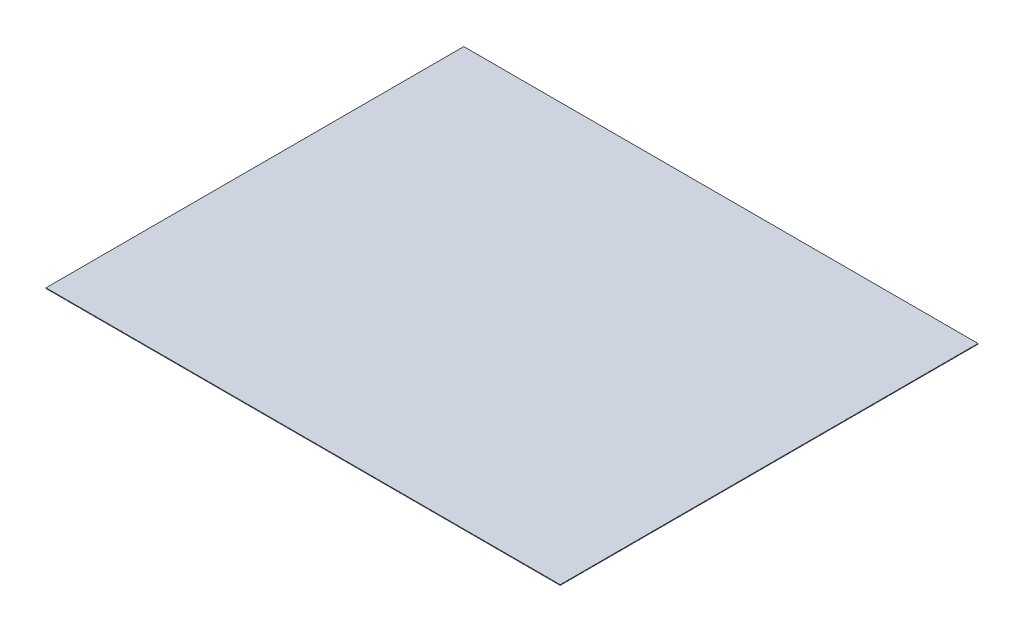
ISO-10303-21;
HEADER;
FILE_DESCRIPTION(('STEP AP214'),'2;1');
FILE_NAME('part.step','',(''),(''),'','','');
FILE_SCHEMA(('AUTOMOTIVE_DESIGN { 1 0 10303 214 1 1 1 1 }'));
ENDSEC;
DATA;
#1=APPLICATION_CONTEXT('core data for automotive mechanical design processes');
#2=APPLICATION_PROTOCOL_DEFINITION('international standard','automotive_design',2000,#1);
#3=PRODUCT_CONTEXT('',#1,'mechanical');
#4=PRODUCT('Part','Part','',(#3));
#5=PRODUCT_RELATED_PRODUCT_CATEGORY('part','',(#4));
#6=PRODUCT_DEFINITION_FORMATION('','',#4);
#7=PRODUCT_DEFINITION_CONTEXT('part definition',#1,'design');
#8=PRODUCT_DEFINITION('design','',#6,#7);
#9=PRODUCT_DEFINITION_SHAPE('','',#8);
#10=(LENGTH_UNIT() NAMED_UNIT(*) SI_UNIT(.MILLI.,.METRE.));
#11=(NAMED_UNIT(*) PLANE_ANGLE_UNIT() SI_UNIT($,.RADIAN.));
#12=(NAMED_UNIT(*) SI_UNIT($,.STERADIAN.) SOLID_ANGLE_UNIT());
#13=UNCERTAINTY_MEASURE_WITH_UNIT(LENGTH_MEASURE(1.E-05),#10,'distance_accuracy_value','');
#14=(GEOMETRIC_REPRESENTATION_CONTEXT(3) GLOBAL_UNCERTAINTY_ASSIGNED_CONTEXT((#13)) GLOBAL_UNIT_ASSIGNED_CONTEXT((#10,
#11,#12)) REPRESENTATION_CONTEXT('',''));
#15=CARTESIAN_POINT('',(0.,0.,0.));
#16=DIRECTION('',(0.,0.,1.));
#17=DIRECTION('',(1.,0.,0.));
#18=AXIS2_PLACEMENT_3D('',#15,#16,#17);
#19=CARTESIAN_POINT('',(800.,2.,650.));
#20=DIRECTION('',(-1.,0.,0.));
#21=DIRECTION('',(0.,0.,1.));
#22=AXIS2_PLACEMENT_3D('',#19,#20,#21);
#23=PLANE('',#22);
#24=DIRECTION('',(0.,0.,-1.));
#25=VECTOR('',#24,1.);
#26=CARTESIAN_POINT('',(800.,0.,650.));
#27=LINE('',#26,#25);
#28=CARTESIAN_POINT('',(800.,0.,650.));
#29=VERTEX_POINT('',#28);
#30=CARTESIAN_POINT('',(800.,0.,-650.));
#31=VERTEX_POINT('',#30);
#32=EDGE_CURVE('E98',#29,#31,#27,.T.);
#33=ORIENTED_EDGE('',*,*,#32,.T.);
#34=DIRECTION('',(0.,-1.,0.));
#35=VECTOR('',#34,1.);
#36=CARTESIAN_POINT('',(800.,2.,-650.));
#37=LINE('',#36,#35);
#38=CARTESIAN_POINT('',(800.,2.,-650.));
#39=VERTEX_POINT('',#38);
#40=EDGE_CURVE('E11',#39,#31,#37,.T.);
#41=ORIENTED_EDGE('',*,*,#40,.F.);
#42=DIRECTION('',(0.,0.,-1.));
#43=VECTOR('',#42,1.);
#44=CARTESIAN_POINT('',(800.,2.,650.));
#45=LINE('',#44,#43);
#46=CARTESIAN_POINT('',(800.,2.,650.));
#47=VERTEX_POINT('',#46);
#48=EDGE_CURVE('E86',#47,#39,#45,.T.);
#49=ORIENTED_EDGE('',*,*,#48,.F.);
#50=DIRECTION('',(0.,-1.,0.));
#51=VECTOR('',#50,1.);
#52=CARTESIAN_POINT('',(800.,2.,650.));
#53=LINE('',#52,#51);
#54=EDGE_CURVE('E94',#47,#29,#53,.T.);
#55=ORIENTED_EDGE('',*,*,#54,.T.);
#56=EDGE_LOOP('',(#33,#41,#49,#55));
#57=FACE_BOUND('',#56,.T.);
#58=ADVANCED_FACE('F35',(#57),#23,.F.);
#59=CARTESIAN_POINT('',(-800.,2.,-650.));
#60=DIRECTION('',(0.,0.,1.));
#61=DIRECTION('',(1.,0.,0.));
#62=AXIS2_PLACEMENT_3D('',#59,#60,#61);
#63=PLANE('',#62);
#64=DIRECTION('',(-1.,0.,0.));
#65=VECTOR('',#64,1.);
#66=CARTESIAN_POINT('',(-800.,0.,-650.));
#67=LINE('',#66,#65);
#68=CARTESIAN_POINT('',(-800.,0.,-650.));
#69=VERTEX_POINT('',#68);
#70=EDGE_CURVE('E90',#31,#69,#67,.T.);
#71=ORIENTED_EDGE('',*,*,#70,.T.);
#72=DIRECTION('',(0.,-1.,0.));
#73=VECTOR('',#72,1.);
#74=CARTESIAN_POINT('',(-800.,2.,-650.));
#75=LINE('',#74,#73);
#76=CARTESIAN_POINT('',(-800.,2.,-650.));
#77=VERTEX_POINT('',#76);
#78=EDGE_CURVE('E43',#77,#69,#75,.T.);
#79=ORIENTED_EDGE('',*,*,#78,.F.);
#80=DIRECTION('',(-1.,0.,0.));
#81=VECTOR('',#80,1.);
#82=CARTESIAN_POINT('',(-800.,2.,-650.));
#83=LINE('',#82,#81);
#84=EDGE_CURVE('E81',#39,#77,#83,.T.);
#85=ORIENTED_EDGE('',*,*,#84,.F.);
#86=ORIENTED_EDGE('',*,*,#40,.T.);
#87=EDGE_LOOP('',(#71,#79,#85,#86));
#88=FACE_BOUND('',#87,.T.);
#89=ADVANCED_FACE('F89',(#88),#63,.F.);
#90=CARTESIAN_POINT('',(-800.,2.,650.));
#91=DIRECTION('',(1.,0.,0.));
#92=DIRECTION('',(0.,0.,-1.));
#93=AXIS2_PLACEMENT_3D('',#90,#91,#92);
#94=PLANE('',#93);
#95=DIRECTION('',(0.,0.,1.));
#96=VECTOR('',#95,1.);
#97=CARTESIAN_POINT('',(-800.,0.,650.));
#98=LINE('',#97,#96);
#99=CARTESIAN_POINT('',(-800.,0.,650.));
#100=VERTEX_POINT('',#99);
#101=EDGE_CURVE('E68',#69,#100,#98,.T.);
#102=ORIENTED_EDGE('',*,*,#101,.T.);
#103=DIRECTION('',(0.,-1.,0.));
#104=VECTOR('',#103,1.);
#105=CARTESIAN_POINT('',(-800.,2.,650.));
#106=LINE('',#105,#104);
#107=CARTESIAN_POINT('',(-800.,2.,650.));
#108=VERTEX_POINT('',#107);
#109=EDGE_CURVE('E91',#108,#100,#106,.T.);
#110=ORIENTED_EDGE('',*,*,#109,.F.);
#111=DIRECTION('',(0.,0.,1.));
#112=VECTOR('',#111,1.);
#113=CARTESIAN_POINT('',(-800.,2.,650.));
#114=LINE('',#113,#112);
#115=EDGE_CURVE('E84',#77,#108,#114,.T.);
#116=ORIENTED_EDGE('',*,*,#115,.F.);
#117=ORIENTED_EDGE('',*,*,#78,.T.);
#118=EDGE_LOOP('',(#102,#110,#116,#117));
#119=FACE_BOUND('',#118,.T.);
#120=ADVANCED_FACE('F92',(#119),#94,.F.);
#121=CARTESIAN_POINT('',(-800.,2.,650.));
#122=DIRECTION('',(0.,0.,-1.));
#123=DIRECTION('',(-1.,0.,0.));
#124=AXIS2_PLACEMENT_3D('',#121,#122,#123);
#125=PLANE('',#124);
#126=DIRECTION('',(1.,0.,0.));
#127=VECTOR('',#126,1.);
#128=CARTESIAN_POINT('',(-800.,0.,650.));
#129=LINE('',#128,#127);
#130=EDGE_CURVE('E74',#100,#29,#129,.T.);
#131=ORIENTED_EDGE('',*,*,#130,.T.);
#132=ORIENTED_EDGE('',*,*,#54,.F.);
#133=DIRECTION('',(1.,0.,0.));
#134=VECTOR('',#133,1.);
#135=CARTESIAN_POINT('',(-800.,2.,650.));
#136=LINE('',#135,#134);
#137=EDGE_CURVE('E51',#108,#47,#136,.T.);
#138=ORIENTED_EDGE('',*,*,#137,.F.);
#139=ORIENTED_EDGE('',*,*,#109,.T.);
#140=EDGE_LOOP('',(#131,#132,#138,#139));
#141=FACE_BOUND('',#140,.T.);
#142=ADVANCED_FACE('F105',(#141),#125,.F.);
#143=CARTESIAN_POINT('',(0.,2.,0.));
#144=DIRECTION('',(0.,-1.,0.));
#145=DIRECTION('',(0.,0.,-1.));
#146=AXIS2_PLACEMENT_3D('',#143,#144,#145);
#147=PLANE('',#146);
#148=ORIENTED_EDGE('',*,*,#48,.T.);
#149=ORIENTED_EDGE('',*,*,#84,.T.);
#150=ORIENTED_EDGE('',*,*,#115,.T.);
#151=ORIENTED_EDGE('',*,*,#137,.T.);
#152=EDGE_LOOP('',(#148,#149,#150,#151));
#153=FACE_BOUND('',#152,.T.);
#154=ADVANCED_FACE('F82',(#153),#147,.F.);
#155=CARTESIAN_POINT('',(0.,0.,0.));
#156=DIRECTION('',(0.,-1.,0.));
#157=DIRECTION('',(0.,0.,-1.));
#158=AXIS2_PLACEMENT_3D('',#155,#156,#157);
#159=PLANE('',#158);
#160=ORIENTED_EDGE('',*,*,#32,.F.);
#161=ORIENTED_EDGE('',*,*,#130,.F.);
#162=ORIENTED_EDGE('',*,*,#101,.F.);
#163=ORIENTED_EDGE('',*,*,#70,.F.);
#164=EDGE_LOOP('',(#160,#161,#162,#163));
#165=FACE_BOUND('',#164,.T.);
#166=ADVANCED_FACE('F108',(#165),#159,.T.);
#167=CLOSED_SHELL('',(#58,#89,#120,#142,#154,#166));
#168=MANIFOLD_SOLID_BREP('B2',#167);
#169=ADVANCED_BREP_SHAPE_REPRESENTATION('',(#18,#168),#14);
#170=SHAPE_DEFINITION_REPRESENTATION(#9,#169);
ENDSEC;
END-ISO-10303-21;
